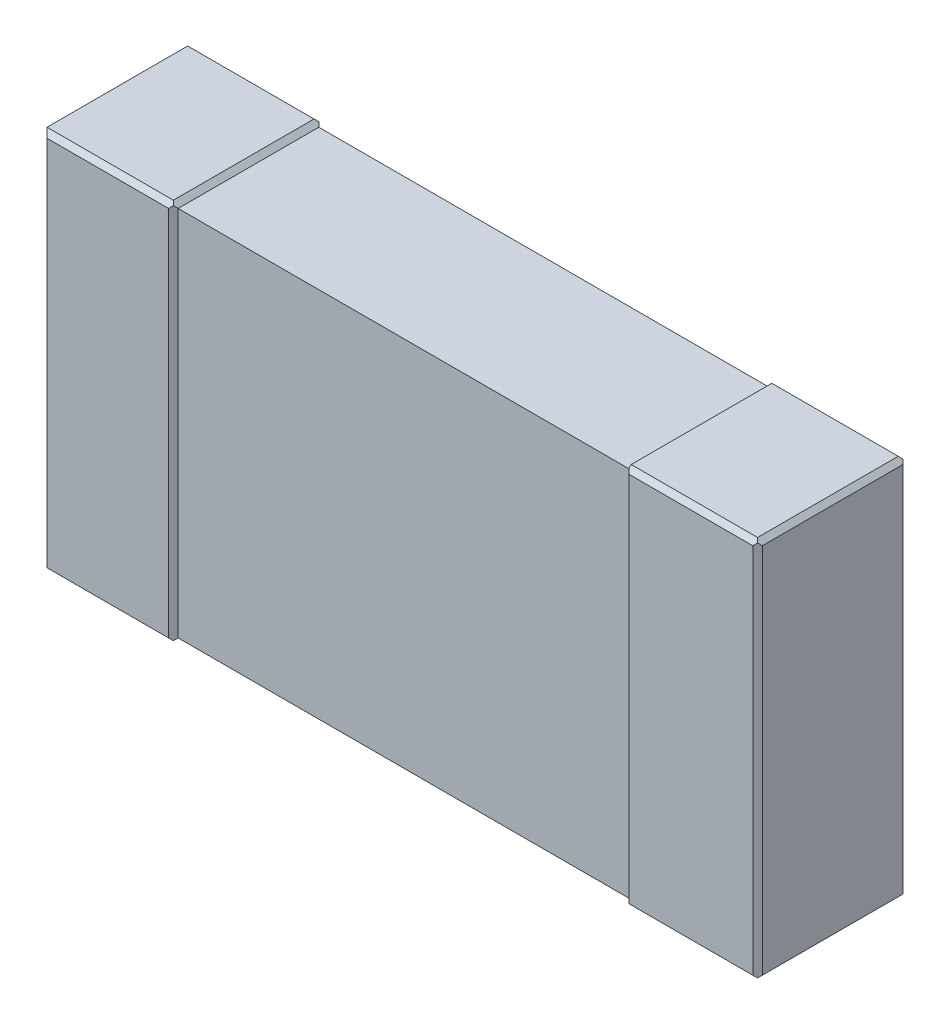
ISO-10303-21;
HEADER;
FILE_DESCRIPTION(('STEP AP214'),'2;1');
FILE_NAME('part.step','',(''),(''),'','','');
FILE_SCHEMA(('AUTOMOTIVE_DESIGN { 1 0 10303 214 1 1 1 1 }'));
ENDSEC;
DATA;
#1=APPLICATION_CONTEXT('core data for automotive mechanical design processes');
#2=APPLICATION_PROTOCOL_DEFINITION('international standard','automotive_design',2000,#1);
#3=PRODUCT_CONTEXT('',#1,'mechanical');
#4=PRODUCT('Part','Part','',(#3));
#5=PRODUCT_RELATED_PRODUCT_CATEGORY('part','',(#4));
#6=PRODUCT_DEFINITION_FORMATION('','',#4);
#7=PRODUCT_DEFINITION_CONTEXT('part definition',#1,'design');
#8=PRODUCT_DEFINITION('design','',#6,#7);
#9=PRODUCT_DEFINITION_SHAPE('','',#8);
#10=(LENGTH_UNIT() NAMED_UNIT(*) SI_UNIT(.MILLI.,.METRE.));
#11=(NAMED_UNIT(*) PLANE_ANGLE_UNIT() SI_UNIT($,.RADIAN.));
#12=(NAMED_UNIT(*) SI_UNIT($,.STERADIAN.) SOLID_ANGLE_UNIT());
#13=UNCERTAINTY_MEASURE_WITH_UNIT(LENGTH_MEASURE(1.E-05),#10,'distance_accuracy_value','');
#14=(GEOMETRIC_REPRESENTATION_CONTEXT(3) GLOBAL_UNCERTAINTY_ASSIGNED_CONTEXT((#13)) GLOBAL_UNIT_ASSIGNED_CONTEXT((#10,
#11,#12)) REPRESENTATION_CONTEXT('',''));
#15=CARTESIAN_POINT('',(0.,0.,0.));
#16=DIRECTION('',(0.,0.,1.));
#17=DIRECTION('',(1.,0.,0.));
#18=AXIS2_PLACEMENT_3D('',#15,#16,#17);
#19=CARTESIAN_POINT('',(1.5,-0.8,0.));
#20=DIRECTION('',(1.,0.,0.));
#21=DIRECTION('',(0.,0.,-1.));
#22=AXIS2_PLACEMENT_3D('',#19,#20,#21);
#23=PLANE('',#22);
#24=DIRECTION('',(0.,0.,-1.));
#25=VECTOR('',#24,1.);
#26=CARTESIAN_POINT('',(1.5,0.78,0.));
#27=LINE('',#26,#25);
#28=CARTESIAN_POINT('',(1.5,0.78,0.0199999999999998));
#29=VERTEX_POINT('',#28);
#30=CARTESIAN_POINT('',(1.5,0.780000000000001,0.61));
#31=VERTEX_POINT('',#30);
#32=EDGE_CURVE('E19',#29,#31,#27,.F.);
#33=ORIENTED_EDGE('',*,*,#32,.T.);
#34=DIRECTION('',(0.,1.,0.));
#35=VECTOR('',#34,1.);
#36=CARTESIAN_POINT('',(1.5,-0.8,0.61));
#37=LINE('',#36,#35);
#38=CARTESIAN_POINT('',(1.5,-0.78,0.61));
#39=VERTEX_POINT('',#38);
#40=EDGE_CURVE('E209',#39,#31,#37,.T.);
#41=ORIENTED_EDGE('',*,*,#40,.F.);
#42=DIRECTION('',(0.,0.,1.));
#43=VECTOR('',#42,1.);
#44=CARTESIAN_POINT('',(1.5,-0.78,0.));
#45=LINE('',#44,#43);
#46=CARTESIAN_POINT('',(1.5,-0.78,0.02));
#47=VERTEX_POINT('',#46);
#48=EDGE_CURVE('E248',#47,#39,#45,.T.);
#49=ORIENTED_EDGE('',*,*,#48,.F.);
#50=DIRECTION('',(0.,1.,0.));
#51=VECTOR('',#50,1.);
#52=CARTESIAN_POINT('',(1.5,0.8,0.0199999999999995));
#53=LINE('',#52,#51);
#54=EDGE_CURVE('E256',#29,#47,#53,.F.);
#55=ORIENTED_EDGE('',*,*,#54,.F.);
#56=EDGE_LOOP('',(#33,#41,#49,#55));
#57=FACE_BOUND('',#56,.T.);
#58=ADVANCED_FACE('F16',(#57),#23,.T.);
#59=CARTESIAN_POINT('',(-1.49,0.8,0.01));
#60=DIRECTION('',(-0.707106781186548,0.,-0.707106781186548));
#61=DIRECTION('',(-0.707106781186548,0.,0.707106781186548));
#62=AXIS2_PLACEMENT_3D('',#59,#60,#61);
#63=PLANE('',#62);
#64=DIRECTION('',(-0.577350269189622,-0.577350269189634,0.577350269189621));
#65=VECTOR('',#64,1.);
#66=CARTESIAN_POINT('',(-1.48,-0.780000000000001,0.));
#67=LINE('',#66,#65);
#68=CARTESIAN_POINT('',(-1.48,-0.780000000000001,0.));
#69=VERTEX_POINT('',#68);
#70=CARTESIAN_POINT('',(-1.49,-0.79,0.0100000000000002));
#71=VERTEX_POINT('',#70);
#72=EDGE_CURVE('E227',#69,#71,#67,.T.);
#73=ORIENTED_EDGE('',*,*,#72,.T.);
#74=DIRECTION('',(-0.57735026918963,0.577350269189618,0.57735026918963));
#75=VECTOR('',#74,1.);
#76=CARTESIAN_POINT('',(-1.49,-0.790000000000001,0.0100000000000004));
#77=LINE('',#76,#75);
#78=CARTESIAN_POINT('',(-1.5,-0.78,0.0200000000000001));
#79=VERTEX_POINT('',#78);
#80=EDGE_CURVE('E215',#71,#79,#77,.T.);
#81=ORIENTED_EDGE('',*,*,#80,.T.);
#82=DIRECTION('',(0.,1.,0.));
#83=VECTOR('',#82,1.);
#84=CARTESIAN_POINT('',(-1.5,0.8,0.02));
#85=LINE('',#84,#83);
#86=CARTESIAN_POINT('',(-1.5,0.8,0.02));
#87=VERTEX_POINT('',#86);
#88=EDGE_CURVE('E270',#87,#79,#85,.F.);
#89=ORIENTED_EDGE('',*,*,#88,.F.);
#90=DIRECTION('',(0.577350269189627,-0.577350269189624,-0.577350269189627));
#91=VECTOR('',#90,1.);
#92=CARTESIAN_POINT('',(-1.5,0.8,0.02));
#93=LINE('',#92,#91);
#94=CARTESIAN_POINT('',(-1.48,0.78,0.));
#95=VERTEX_POINT('',#94);
#96=EDGE_CURVE('E240',#87,#95,#93,.T.);
#97=ORIENTED_EDGE('',*,*,#96,.T.);
#98=DIRECTION('',(0.,1.,0.));
#99=VECTOR('',#98,1.);
#100=CARTESIAN_POINT('',(-1.48,0.8,0.));
#101=LINE('',#100,#99);
#102=EDGE_CURVE('E238',#69,#95,#101,.T.);
#103=ORIENTED_EDGE('',*,*,#102,.F.);
#104=EDGE_LOOP('',(#73,#81,#89,#97,#103));
#105=FACE_BOUND('',#104,.T.);
#106=ADVANCED_FACE('F236',(#105),#63,.T.);
#107=CARTESIAN_POINT('',(1.49,-0.8,0.62));
#108=DIRECTION('',(0.707106781186548,0.,0.707106781186548));
#109=DIRECTION('',(0.707106781186548,0.,-0.707106781186548));
#110=AXIS2_PLACEMENT_3D('',#107,#108,#109);
#111=PLANE('',#110);
#112=DIRECTION('',(0.577350269189628,-0.577350269189622,-0.577350269189628));
#113=VECTOR('',#112,1.);
#114=CARTESIAN_POINT('',(1.48,-0.78,0.63));
#115=LINE('',#114,#113);
#116=CARTESIAN_POINT('',(1.48,-0.78,0.63));
#117=VERTEX_POINT('',#116);
#118=CARTESIAN_POINT('',(1.49,-0.79,0.62));
#119=VERTEX_POINT('',#118);
#120=EDGE_CURVE('E246',#117,#119,#115,.T.);
#121=ORIENTED_EDGE('',*,*,#120,.T.);
#122=DIRECTION('',(-0.577350269189626,-0.577350269189626,0.577350269189626));
#123=VECTOR('',#122,1.);
#124=CARTESIAN_POINT('',(1.5,-0.78,0.61));
#125=LINE('',#124,#123);
#126=EDGE_CURVE('E251',#39,#119,#125,.T.);
#127=ORIENTED_EDGE('',*,*,#126,.F.);
#128=ORIENTED_EDGE('',*,*,#40,.T.);
#129=DIRECTION('',(0.577350269189626,-0.577350269189626,-0.577350269189626));
#130=VECTOR('',#129,1.);
#131=CARTESIAN_POINT('',(1.49,0.79,0.62));
#132=LINE('',#131,#130);
#133=CARTESIAN_POINT('',(1.49,0.79,0.62));
#134=VERTEX_POINT('',#133);
#135=EDGE_CURVE('E272',#134,#31,#132,.T.);
#136=ORIENTED_EDGE('',*,*,#135,.F.);
#137=DIRECTION('',(-0.57735026918963,-0.577350269189617,0.57735026918963));
#138=VECTOR('',#137,1.);
#139=CARTESIAN_POINT('',(1.49,0.790000000000001,0.62));
#140=LINE('',#139,#138);
#141=CARTESIAN_POINT('',(1.48,0.780000000000001,0.63));
#142=VERTEX_POINT('',#141);
#143=EDGE_CURVE('E244',#134,#142,#140,.T.);
#144=ORIENTED_EDGE('',*,*,#143,.T.);
#145=DIRECTION('',(0.,-1.,0.));
#146=VECTOR('',#145,1.);
#147=CARTESIAN_POINT('',(1.48,-0.8,0.63));
#148=LINE('',#147,#146);
#149=EDGE_CURVE('E278',#117,#142,#148,.F.);
#150=ORIENTED_EDGE('',*,*,#149,.F.);
#151=EDGE_LOOP('',(#121,#127,#128,#136,#144,#150));
#152=FACE_BOUND('',#151,.T.);
#153=ADVANCED_FACE('F635',(#152),#111,.T.);
#154=CARTESIAN_POINT('',(1.49,-0.79,0.));
#155=DIRECTION('',(0.707106781186548,-0.707106781186548,0.));
#156=DIRECTION('',(0.707106781186548,0.707106781186548,0.));
#157=AXIS2_PLACEMENT_3D('',#154,#155,#156);
#158=PLANE('',#157);
#159=DIRECTION('',(-0.577350269189627,-0.577350269189627,0.577350269189624));
#160=VECTOR('',#159,1.);
#161=CARTESIAN_POINT('',(1.49,-0.79,0.00999999999999997));
#162=LINE('',#161,#160);
#163=CARTESIAN_POINT('',(1.49,-0.790000000000001,0.00999999999999987));
#164=VERTEX_POINT('',#163);
#165=CARTESIAN_POINT('',(1.48,-0.8,0.02));
#166=VERTEX_POINT('',#165);
#167=EDGE_CURVE('E295',#164,#166,#162,.T.);
#168=ORIENTED_EDGE('',*,*,#167,.F.);
#169=DIRECTION('',(-0.57735026918963,-0.577350269189618,-0.57735026918963));
#170=VECTOR('',#169,1.);
#171=CARTESIAN_POINT('',(1.5,-0.780000000000001,0.0199999999999998));
#172=LINE('',#171,#170);
#173=EDGE_CURVE('E259',#47,#164,#172,.T.);
#174=ORIENTED_EDGE('',*,*,#173,.F.);
#175=ORIENTED_EDGE('',*,*,#48,.T.);
#176=ORIENTED_EDGE('',*,*,#126,.T.);
#177=DIRECTION('',(0.577350269189626,0.577350269189626,0.577350269189626));
#178=VECTOR('',#177,1.);
#179=CARTESIAN_POINT('',(1.48,-0.8,0.61));
#180=LINE('',#179,#178);
#181=CARTESIAN_POINT('',(1.48,-0.8,0.61));
#182=VERTEX_POINT('',#181);
#183=EDGE_CURVE('E283',#182,#119,#180,.T.);
#184=ORIENTED_EDGE('',*,*,#183,.F.);
#185=DIRECTION('',(0.,0.,-1.));
#186=VECTOR('',#185,1.);
#187=CARTESIAN_POINT('',(1.48,-0.8,0.));
#188=LINE('',#187,#186);
#189=EDGE_CURVE('E286',#166,#182,#188,.F.);
#190=ORIENTED_EDGE('',*,*,#189,.F.);
#191=EDGE_LOOP('',(#168,#174,#175,#176,#184,#190));
#192=FACE_BOUND('',#191,.T.);
#193=ADVANCED_FACE('F533',(#192),#158,.T.);
#194=CARTESIAN_POINT('',(1.49,0.8,0.009999999999999));
#195=DIRECTION('',(0.707106781186548,0.,-0.707106781186548));
#196=DIRECTION('',(-0.707106781186548,0.,-0.707106781186548));
#197=AXIS2_PLACEMENT_3D('',#194,#195,#196);
#198=PLANE('',#197);
#199=DIRECTION('',(0.577350269189626,-0.577350269189626,0.577350269189625));
#200=VECTOR('',#199,1.);
#201=CARTESIAN_POINT('',(1.48,-0.78,0.));
#202=LINE('',#201,#200);
#203=CARTESIAN_POINT('',(1.48,-0.780000000000001,0.));
#204=VERTEX_POINT('',#203);
#205=EDGE_CURVE('E292',#204,#164,#202,.T.);
#206=ORIENTED_EDGE('',*,*,#205,.F.);
#207=DIRECTION('',(0.,1.,0.));
#208=VECTOR('',#207,1.);
#209=CARTESIAN_POINT('',(1.48,0.8,0.));
#210=LINE('',#209,#208);
#211=CARTESIAN_POINT('',(1.48,0.78,0.));
#212=VERTEX_POINT('',#211);
#213=EDGE_CURVE('E301',#212,#204,#210,.F.);
#214=ORIENTED_EDGE('',*,*,#213,.F.);
#215=DIRECTION('',(0.577350269189624,0.57735026918963,0.577350269189623));
#216=VECTOR('',#215,1.);
#217=CARTESIAN_POINT('',(1.48,0.78,0.));
#218=LINE('',#217,#216);
#219=CARTESIAN_POINT('',(1.49,0.79,0.00999999999999907));
#220=VERTEX_POINT('',#219);
#221=EDGE_CURVE('E254',#212,#220,#218,.T.);
#222=ORIENTED_EDGE('',*,*,#221,.T.);
#223=DIRECTION('',(-0.577350269189605,0.577350269189611,-0.577350269189661));
#224=VECTOR('',#223,1.);
#225=CARTESIAN_POINT('',(1.5,0.78,0.0199999999999998));
#226=LINE('',#225,#224);
#227=EDGE_CURVE('E275',#29,#220,#226,.T.);
#228=ORIENTED_EDGE('',*,*,#227,.F.);
#229=ORIENTED_EDGE('',*,*,#54,.T.);
#230=ORIENTED_EDGE('',*,*,#173,.T.);
#231=EDGE_LOOP('',(#206,#214,#222,#228,#229,#230));
#232=FACE_BOUND('',#231,.T.);
#233=ADVANCED_FACE('F523',(#232),#198,.T.);
#234=CARTESIAN_POINT('',(-0.95,0.8,0.));
#235=DIRECTION('',(0.,0.,-1.));
#236=DIRECTION('',(0.,1.,0.));
#237=AXIS2_PLACEMENT_3D('',#234,#235,#236);
#238=PLANE('',#237);
#239=ORIENTED_EDGE('',*,*,#102,.T.);
#240=DIRECTION('',(1.,0.,0.));
#241=VECTOR('',#240,1.);
#242=CARTESIAN_POINT('',(-0.95,0.78,0.));
#243=LINE('',#242,#241);
#244=CARTESIAN_POINT('',(-0.97,0.78,0.));
#245=VERTEX_POINT('',#244);
#246=EDGE_CURVE('E264',#95,#245,#243,.T.);
#247=ORIENTED_EDGE('',*,*,#246,.T.);
#248=DIRECTION('',(0.,1.,0.));
#249=VECTOR('',#248,1.);
#250=CARTESIAN_POINT('',(-0.97,0.8,0.));
#251=LINE('',#250,#249);
#252=CARTESIAN_POINT('',(-0.97,-0.780000000000001,0.));
#253=VERTEX_POINT('',#252);
#254=EDGE_CURVE('E307',#253,#245,#251,.T.);
#255=ORIENTED_EDGE('',*,*,#254,.F.);
#256=DIRECTION('',(1.,0.,0.));
#257=VECTOR('',#256,1.);
#258=CARTESIAN_POINT('',(-0.95,-0.78,0.));
#259=LINE('',#258,#257);
#260=EDGE_CURVE('E261',#253,#69,#259,.F.);
#261=ORIENTED_EDGE('',*,*,#260,.T.);
#262=EDGE_LOOP('',(#239,#247,#255,#261));
#263=FACE_BOUND('',#262,.T.);
#264=ADVANCED_FACE('F520',(#263),#238,.T.);
#265=CARTESIAN_POINT('',(-1.5,0.8,0.));
#266=DIRECTION('',(-1.,0.,0.));
#267=DIRECTION('',(0.,0.,1.));
#268=AXIS2_PLACEMENT_3D('',#265,#266,#267);
#269=PLANE('',#268);
#270=DIRECTION('',(0.,0.,1.));
#271=VECTOR('',#270,1.);
#272=CARTESIAN_POINT('',(-1.5,0.8,0.));
#273=LINE('',#272,#271);
#274=CARTESIAN_POINT('',(-1.5,0.8,0.61));
#275=VERTEX_POINT('',#274);
#276=EDGE_CURVE('E267',#275,#87,#273,.F.);
#277=ORIENTED_EDGE('',*,*,#276,.T.);
#278=ORIENTED_EDGE('',*,*,#88,.T.);
#279=DIRECTION('',(0.,0.,1.));
#280=VECTOR('',#279,1.);
#281=CARTESIAN_POINT('',(-1.5,-0.78,0.));
#282=LINE('',#281,#280);
#283=CARTESIAN_POINT('',(-1.5,-0.78,0.61));
#284=VERTEX_POINT('',#283);
#285=EDGE_CURVE('E222',#79,#284,#282,.T.);
#286=ORIENTED_EDGE('',*,*,#285,.T.);
#287=DIRECTION('',(0.,1.,0.));
#288=VECTOR('',#287,1.);
#289=CARTESIAN_POINT('',(-1.5,0.8,0.61));
#290=LINE('',#289,#288);
#291=EDGE_CURVE('E317',#275,#284,#290,.F.);
#292=ORIENTED_EDGE('',*,*,#291,.F.);
#293=EDGE_LOOP('',(#277,#278,#286,#292));
#294=FACE_BOUND('',#293,.T.);
#295=ADVANCED_FACE('F522',(#294),#269,.T.);
#296=CARTESIAN_POINT('',(1.49,0.79,0.63));
#297=DIRECTION('',(0.707106781186548,0.707106781186548,0.));
#298=DIRECTION('',(-0.707106781186548,0.707106781186548,0.));
#299=AXIS2_PLACEMENT_3D('',#296,#297,#298);
#300=PLANE('',#299);
#301=DIRECTION('',(0.577350269189606,-0.577350269189638,-0.577350269189633));
#302=VECTOR('',#301,1.);
#303=CARTESIAN_POINT('',(1.48,0.8,0.0199999999999999));
#304=LINE('',#303,#302);
#305=CARTESIAN_POINT('',(1.48,0.8,0.0199999999999998));
#306=VERTEX_POINT('',#305);
#307=EDGE_CURVE('E334',#306,#220,#304,.T.);
#308=ORIENTED_EDGE('',*,*,#307,.F.);
#309=DIRECTION('',(0.,0.,1.));
#310=VECTOR('',#309,1.);
#311=CARTESIAN_POINT('',(1.48,0.8,0.63));
#312=LINE('',#311,#310);
#313=CARTESIAN_POINT('',(1.48,0.8,0.61));
#314=VERTEX_POINT('',#313);
#315=EDGE_CURVE('E339',#314,#306,#312,.F.);
#316=ORIENTED_EDGE('',*,*,#315,.F.);
#317=DIRECTION('',(-0.577350269189626,0.577350269189626,-0.577350269189626));
#318=VECTOR('',#317,1.);
#319=CARTESIAN_POINT('',(1.49,0.79,0.62));
#320=LINE('',#319,#318);
#321=EDGE_CURVE('E348',#134,#314,#320,.T.);
#322=ORIENTED_EDGE('',*,*,#321,.F.);
#323=ORIENTED_EDGE('',*,*,#135,.T.);
#324=ORIENTED_EDGE('',*,*,#32,.F.);
#325=ORIENTED_EDGE('',*,*,#227,.T.);
#326=EDGE_LOOP('',(#308,#316,#322,#323,#324,#325));
#327=FACE_BOUND('',#326,.T.);
#328=ADVANCED_FACE('F530',(#327),#300,.T.);
#329=CARTESIAN_POINT('',(0.95,-0.8,0.63));
#330=DIRECTION('',(0.,0.,1.));
#331=DIRECTION('',(0.,-1.,0.));
#332=AXIS2_PLACEMENT_3D('',#329,#330,#331);
#333=PLANE('',#332);
#334=DIRECTION('',(1.,0.,0.));
#335=VECTOR('',#334,1.);
#336=CARTESIAN_POINT('',(0.95,0.78,0.63));
#337=LINE('',#336,#335);
#338=CARTESIAN_POINT('',(0.96,0.780000000000001,0.63));
#339=VERTEX_POINT('',#338);
#340=EDGE_CURVE('E345',#339,#142,#337,.T.);
#341=ORIENTED_EDGE('',*,*,#340,.F.);
#342=DIRECTION('',(0.,1.,0.));
#343=VECTOR('',#342,1.);
#344=CARTESIAN_POINT('',(0.96,-0.78,0.63));
#345=LINE('',#344,#343);
#346=CARTESIAN_POINT('',(0.96,-0.78,0.63));
#347=VERTEX_POINT('',#346);
#348=EDGE_CURVE('E359',#339,#347,#345,.F.);
#349=ORIENTED_EDGE('',*,*,#348,.T.);
#350=DIRECTION('',(1.,0.,0.));
#351=VECTOR('',#350,1.);
#352=CARTESIAN_POINT('',(0.95,-0.78,0.63));
#353=LINE('',#352,#351);
#354=EDGE_CURVE('E281',#117,#347,#353,.F.);
#355=ORIENTED_EDGE('',*,*,#354,.F.);
#356=ORIENTED_EDGE('',*,*,#149,.T.);
#357=EDGE_LOOP('',(#341,#349,#355,#356));
#358=FACE_BOUND('',#357,.T.);
#359=ADVANCED_FACE('F616',(#358),#333,.T.);
#360=CARTESIAN_POINT('',(0.95,-0.79,0.62));
#361=DIRECTION('',(0.,-0.707106781186548,0.707106781186548));
#362=DIRECTION('',(0.,-0.707106781186548,-0.707106781186548));
#363=AXIS2_PLACEMENT_3D('',#360,#361,#362);
#364=PLANE('',#363);
#365=ORIENTED_EDGE('',*,*,#183,.T.);
#366=ORIENTED_EDGE('',*,*,#120,.F.);
#367=ORIENTED_EDGE('',*,*,#354,.T.);
#368=DIRECTION('',(-0.577350269189628,-0.577350269189622,-0.577350269189628));
#369=VECTOR('',#368,1.);
#370=CARTESIAN_POINT('',(0.96,-0.78,0.63));
#371=LINE('',#370,#369);
#372=CARTESIAN_POINT('',(0.95,-0.79,0.62));
#373=VERTEX_POINT('',#372);
#374=EDGE_CURVE('E354',#347,#373,#371,.T.);
#375=ORIENTED_EDGE('',*,*,#374,.T.);
#376=DIRECTION('',(0.577350269189626,-0.577350269189626,-0.577350269189626));
#377=VECTOR('',#376,1.);
#378=CARTESIAN_POINT('',(0.95,-0.79,0.62));
#379=LINE('',#378,#377);
#380=CARTESIAN_POINT('',(0.96,-0.8,0.61));
#381=VERTEX_POINT('',#380);
#382=EDGE_CURVE('E362',#373,#381,#379,.T.);
#383=ORIENTED_EDGE('',*,*,#382,.T.);
#384=DIRECTION('',(1.,0.,0.));
#385=VECTOR('',#384,1.);
#386=CARTESIAN_POINT('',(0.95,-0.8,0.61));
#387=LINE('',#386,#385);
#388=EDGE_CURVE('E289',#182,#381,#387,.F.);
#389=ORIENTED_EDGE('',*,*,#388,.F.);
#390=EDGE_LOOP('',(#365,#366,#367,#375,#383,#389));
#391=FACE_BOUND('',#390,.T.);
#392=ADVANCED_FACE('F612',(#391),#364,.T.);
#393=CARTESIAN_POINT('',(0.95,-0.8,0.));
#394=DIRECTION('',(0.,-1.,0.));
#395=DIRECTION('',(0.,0.,-1.));
#396=AXIS2_PLACEMENT_3D('',#393,#394,#395);
#397=PLANE('',#396);
#398=ORIENTED_EDGE('',*,*,#388,.T.);
#399=DIRECTION('',(0.,0.,1.));
#400=VECTOR('',#399,1.);
#401=CARTESIAN_POINT('',(0.96,-0.8,0.02));
#402=LINE('',#401,#400);
#403=CARTESIAN_POINT('',(0.96,-0.8,0.02));
#404=VERTEX_POINT('',#403);
#405=EDGE_CURVE('E364',#381,#404,#402,.F.);
#406=ORIENTED_EDGE('',*,*,#405,.T.);
#407=DIRECTION('',(1.,0.,0.));
#408=VECTOR('',#407,1.);
#409=CARTESIAN_POINT('',(0.95,-0.8,0.02));
#410=LINE('',#409,#408);
#411=EDGE_CURVE('E298',#166,#404,#410,.F.);
#412=ORIENTED_EDGE('',*,*,#411,.F.);
#413=ORIENTED_EDGE('',*,*,#189,.T.);
#414=EDGE_LOOP('',(#398,#406,#412,#413));
#415=FACE_BOUND('',#414,.T.);
#416=ADVANCED_FACE('F608',(#415),#397,.T.);
#417=CARTESIAN_POINT('',(0.95,-0.79,0.01));
#418=DIRECTION('',(0.,-0.707106781186548,-0.707106781186548));
#419=DIRECTION('',(0.,0.707106781186548,-0.707106781186548));
#420=AXIS2_PLACEMENT_3D('',#417,#418,#419);
#421=PLANE('',#420);
#422=DIRECTION('',(0.577350269189622,0.577350269189629,-0.577350269189626));
#423=VECTOR('',#422,1.);
#424=CARTESIAN_POINT('',(0.95,-0.790000000000001,0.0100000000000003));
#425=LINE('',#424,#423);
#426=CARTESIAN_POINT('',(0.95,-0.79,0.01));
#427=VERTEX_POINT('',#426);
#428=CARTESIAN_POINT('',(0.96,-0.780000000000001,0.));
#429=VERTEX_POINT('',#428);
#430=EDGE_CURVE('E370',#427,#429,#425,.T.);
#431=ORIENTED_EDGE('',*,*,#430,.T.);
#432=DIRECTION('',(1.,0.,0.));
#433=VECTOR('',#432,1.);
#434=CARTESIAN_POINT('',(0.95,-0.78,0.));
#435=LINE('',#434,#433);
#436=EDGE_CURVE('E304',#204,#429,#435,.F.);
#437=ORIENTED_EDGE('',*,*,#436,.F.);
#438=ORIENTED_EDGE('',*,*,#205,.T.);
#439=ORIENTED_EDGE('',*,*,#167,.T.);
#440=ORIENTED_EDGE('',*,*,#411,.T.);
#441=DIRECTION('',(-0.577350269189626,0.577350269189626,-0.577350269189625));
#442=VECTOR('',#441,1.);
#443=CARTESIAN_POINT('',(0.96,-0.8,0.02));
#444=LINE('',#443,#442);
#445=EDGE_CURVE('E366',#404,#427,#444,.T.);
#446=ORIENTED_EDGE('',*,*,#445,.T.);
#447=EDGE_LOOP('',(#431,#437,#438,#439,#440,#446));
#448=FACE_BOUND('',#447,.T.);
#449=ADVANCED_FACE('F604',(#448),#421,.T.);
#450=CARTESIAN_POINT('',(0.95,0.8,0.));
#451=DIRECTION('',(0.,0.,-1.));
#452=DIRECTION('',(0.,1.,0.));
#453=AXIS2_PLACEMENT_3D('',#450,#451,#452);
#454=PLANE('',#453);
#455=ORIENTED_EDGE('',*,*,#436,.T.);
#456=DIRECTION('',(0.,1.,0.));
#457=VECTOR('',#456,1.);
#458=CARTESIAN_POINT('',(0.96,0.78,0.));
#459=LINE('',#458,#457);
#460=CARTESIAN_POINT('',(0.96,0.78,0.));
#461=VERTEX_POINT('',#460);
#462=EDGE_CURVE('E372',#429,#461,#459,.T.);
#463=ORIENTED_EDGE('',*,*,#462,.T.);
#464=DIRECTION('',(1.,0.,0.));
#465=VECTOR('',#464,1.);
#466=CARTESIAN_POINT('',(0.95,0.78,0.));
#467=LINE('',#466,#465);
#468=EDGE_CURVE('E337',#212,#461,#467,.F.);
#469=ORIENTED_EDGE('',*,*,#468,.F.);
#470=ORIENTED_EDGE('',*,*,#213,.T.);
#471=EDGE_LOOP('',(#455,#463,#469,#470));
#472=FACE_BOUND('',#471,.T.);
#473=ADVANCED_FACE('F601',(#472),#454,.T.);
#474=CARTESIAN_POINT('',(-0.96,0.8,0.01));
#475=DIRECTION('',(0.707106781186548,0.,-0.707106781186548));
#476=DIRECTION('',(-0.707106781186548,0.,-0.707106781186548));
#477=AXIS2_PLACEMENT_3D('',#474,#475,#476);
#478=PLANE('',#477);
#479=DIRECTION('',(-0.57735026918963,-0.577350269189618,-0.57735026918963));
#480=VECTOR('',#479,1.);
#481=CARTESIAN_POINT('',(-0.95,-0.780000000000001,0.0200000000000005));
#482=LINE('',#481,#480);
#483=CARTESIAN_POINT('',(-0.95,-0.780000000000001,0.0200000000000003));
#484=VERTEX_POINT('',#483);
#485=CARTESIAN_POINT('',(-0.96,-0.790000000000001,0.0100000000000002));
#486=VERTEX_POINT('',#485);
#487=EDGE_CURVE('E312',#484,#486,#482,.T.);
#488=ORIENTED_EDGE('',*,*,#487,.T.);
#489=DIRECTION('',(0.577350269189642,-0.577350269189617,0.577350269189618));
#490=VECTOR('',#489,1.);
#491=CARTESIAN_POINT('',(-0.97,-0.780000000000001,0.));
#492=LINE('',#491,#490);
#493=EDGE_CURVE('E326',#253,#486,#492,.T.);
#494=ORIENTED_EDGE('',*,*,#493,.F.);
#495=ORIENTED_EDGE('',*,*,#254,.T.);
#496=DIRECTION('',(0.577350269189625,0.577350269189625,0.577350269189627));
#497=VECTOR('',#496,1.);
#498=CARTESIAN_POINT('',(-0.97,0.78,0.));
#499=LINE('',#498,#497);
#500=CARTESIAN_POINT('',(-0.96,0.79,0.00999999999999996));
#501=VERTEX_POINT('',#500);
#502=EDGE_CURVE('E234',#245,#501,#499,.T.);
#503=ORIENTED_EDGE('',*,*,#502,.T.);
#504=DIRECTION('',(0.577350269189628,-0.577350269189622,0.577350269189628));
#505=VECTOR('',#504,1.);
#506=CARTESIAN_POINT('',(-0.96,0.79,0.01));
#507=LINE('',#506,#505);
#508=CARTESIAN_POINT('',(-0.95,0.78,0.02));
#509=VERTEX_POINT('',#508);
#510=EDGE_CURVE('E310',#501,#509,#507,.T.);
#511=ORIENTED_EDGE('',*,*,#510,.T.);
#512=DIRECTION('',(0.,1.,0.));
#513=VECTOR('',#512,1.);
#514=CARTESIAN_POINT('',(-0.95,0.78,0.02));
#515=LINE('',#514,#513);
#516=EDGE_CURVE('E375',#484,#509,#515,.T.);
#517=ORIENTED_EDGE('',*,*,#516,.F.);
#518=EDGE_LOOP('',(#488,#494,#495,#503,#511,#517));
#519=FACE_BOUND('',#518,.T.);
#520=ADVANCED_FACE('F491',(#519),#478,.T.);
#521=CARTESIAN_POINT('',(-1.49,0.8,0.62));
#522=DIRECTION('',(-0.707106781186548,0.,0.707106781186548));
#523=DIRECTION('',(0.707106781186548,0.,0.707106781186548));
#524=AXIS2_PLACEMENT_3D('',#521,#522,#523);
#525=PLANE('',#524);
#526=DIRECTION('',(0.57735026918963,0.577350269189617,0.57735026918963));
#527=VECTOR('',#526,1.);
#528=CARTESIAN_POINT('',(-1.49,-0.790000000000001,0.62));
#529=LINE('',#528,#527);
#530=CARTESIAN_POINT('',(-1.49,-0.79,0.62));
#531=VERTEX_POINT('',#530);
#532=CARTESIAN_POINT('',(-1.48,-0.780000000000001,0.63));
#533=VERTEX_POINT('',#532);
#534=EDGE_CURVE('E320',#531,#533,#529,.T.);
#535=ORIENTED_EDGE('',*,*,#534,.T.);
#536=DIRECTION('',(0.,-1.,0.));
#537=VECTOR('',#536,1.);
#538=CARTESIAN_POINT('',(-1.48,0.8,0.63));
#539=LINE('',#538,#537);
#540=CARTESIAN_POINT('',(-1.48,0.78,0.63));
#541=VERTEX_POINT('',#540);
#542=EDGE_CURVE('E378',#541,#533,#539,.T.);
#543=ORIENTED_EDGE('',*,*,#542,.F.);
#544=DIRECTION('',(-0.577350269189627,0.577350269189624,-0.577350269189627));
#545=VECTOR('',#544,1.);
#546=CARTESIAN_POINT('',(-1.48,0.78,0.63));
#547=LINE('',#546,#545);
#548=EDGE_CURVE('E314',#541,#275,#547,.T.);
#549=ORIENTED_EDGE('',*,*,#548,.T.);
#550=ORIENTED_EDGE('',*,*,#291,.T.);
#551=DIRECTION('',(-0.577350269189624,0.57735026918963,-0.577350269189624));
#552=VECTOR('',#551,1.);
#553=CARTESIAN_POINT('',(-1.49,-0.79,0.62));
#554=LINE('',#553,#552);
#555=EDGE_CURVE('E322',#531,#284,#554,.T.);
#556=ORIENTED_EDGE('',*,*,#555,.F.);
#557=EDGE_LOOP('',(#535,#543,#549,#550,#556));
#558=FACE_BOUND('',#557,.T.);
#559=ADVANCED_FACE('F595',(#558),#525,.T.);
#560=CARTESIAN_POINT('',(-1.49,-0.79,0.));
#561=DIRECTION('',(-0.707106781186548,-0.707106781186548,0.));
#562=DIRECTION('',(0.707106781186548,-0.707106781186548,0.));
#563=AXIS2_PLACEMENT_3D('',#560,#561,#562);
#564=PLANE('',#563);
#565=DIRECTION('',(0.577350269189626,-0.577350269189626,-0.577350269189626));
#566=VECTOR('',#565,1.);
#567=CARTESIAN_POINT('',(-1.49,-0.79,0.62));
#568=LINE('',#567,#566);
#569=CARTESIAN_POINT('',(-1.48,-0.8,0.61));
#570=VERTEX_POINT('',#569);
#571=EDGE_CURVE('E381',#531,#570,#568,.T.);
#572=ORIENTED_EDGE('',*,*,#571,.F.);
#573=ORIENTED_EDGE('',*,*,#555,.T.);
#574=ORIENTED_EDGE('',*,*,#285,.F.);
#575=ORIENTED_EDGE('',*,*,#80,.F.);
#576=DIRECTION('',(-0.577350269189626,0.577350269189626,-0.577350269189626));
#577=VECTOR('',#576,1.);
#578=CARTESIAN_POINT('',(-1.48,-0.8,0.02));
#579=LINE('',#578,#577);
#580=CARTESIAN_POINT('',(-1.48,-0.8,0.02));
#581=VERTEX_POINT('',#580);
#582=EDGE_CURVE('E219',#581,#71,#579,.T.);
#583=ORIENTED_EDGE('',*,*,#582,.F.);
#584=DIRECTION('',(0.,0.,-1.));
#585=VECTOR('',#584,1.);
#586=CARTESIAN_POINT('',(-1.48,-0.8,0.63));
#587=LINE('',#586,#585);
#588=EDGE_CURVE('E324',#570,#581,#587,.T.);
#589=ORIENTED_EDGE('',*,*,#588,.F.);
#590=EDGE_LOOP('',(#572,#573,#574,#575,#583,#589));
#591=FACE_BOUND('',#590,.T.);
#592=ADVANCED_FACE('F218',(#591),#564,.T.);
#593=CARTESIAN_POINT('',(-1.5,-0.8,0.63));
#594=DIRECTION('',(0.,-1.,0.));
#595=DIRECTION('',(0.,0.,-1.));
#596=AXIS2_PLACEMENT_3D('',#593,#594,#595);
#597=PLANE('',#596);
#598=ORIENTED_EDGE('',*,*,#588,.T.);
#599=DIRECTION('',(1.,0.,0.));
#600=VECTOR('',#599,1.);
#601=CARTESIAN_POINT('',(-0.97,-0.8,0.02));
#602=LINE('',#601,#600);
#603=CARTESIAN_POINT('',(-0.97,-0.8,0.02));
#604=VERTEX_POINT('',#603);
#605=EDGE_CURVE('E233',#604,#581,#602,.F.);
#606=ORIENTED_EDGE('',*,*,#605,.F.);
#607=DIRECTION('',(0.,0.,1.));
#608=VECTOR('',#607,1.);
#609=CARTESIAN_POINT('',(-0.97,-0.8,0.63));
#610=LINE('',#609,#608);
#611=CARTESIAN_POINT('',(-0.97,-0.8,0.61));
#612=VERTEX_POINT('',#611);
#613=EDGE_CURVE('E392',#612,#604,#610,.F.);
#614=ORIENTED_EDGE('',*,*,#613,.F.);
#615=DIRECTION('',(1.,0.,0.));
#616=VECTOR('',#615,1.);
#617=CARTESIAN_POINT('',(-1.5,-0.8,0.61));
#618=LINE('',#617,#616);
#619=EDGE_CURVE('E384',#570,#612,#618,.T.);
#620=ORIENTED_EDGE('',*,*,#619,.F.);
#621=EDGE_LOOP('',(#598,#606,#614,#620));
#622=FACE_BOUND('',#621,.T.);
#623=ADVANCED_FACE('F517',(#622),#597,.T.);
#624=CARTESIAN_POINT('',(-0.97,-0.79,0.01));
#625=DIRECTION('',(0.,-0.707106781186548,-0.707106781186548));
#626=DIRECTION('',(0.,0.707106781186548,-0.707106781186548));
#627=AXIS2_PLACEMENT_3D('',#624,#625,#626);
#628=PLANE('',#627);
#629=ORIENTED_EDGE('',*,*,#72,.F.);
#630=ORIENTED_EDGE('',*,*,#260,.F.);
#631=ORIENTED_EDGE('',*,*,#493,.T.);
#632=DIRECTION('',(0.577350269189626,0.577350269189626,-0.577350269189626));
#633=VECTOR('',#632,1.);
#634=CARTESIAN_POINT('',(-0.97,-0.8,0.0199999999999998));
#635=LINE('',#634,#633);
#636=EDGE_CURVE('E395',#604,#486,#635,.T.);
#637=ORIENTED_EDGE('',*,*,#636,.F.);
#638=ORIENTED_EDGE('',*,*,#605,.T.);
#639=ORIENTED_EDGE('',*,*,#582,.T.);
#640=EDGE_LOOP('',(#629,#630,#631,#637,#638,#639));
#641=FACE_BOUND('',#640,.T.);
#642=ADVANCED_FACE('F230',(#641),#628,.T.);
#643=CARTESIAN_POINT('',(-0.97,0.79,0.01));
#644=DIRECTION('',(0.,-0.707106781186548,0.707106781186548));
#645=DIRECTION('',(0.,-0.707106781186548,-0.707106781186548));
#646=AXIS2_PLACEMENT_3D('',#643,#644,#645);
#647=PLANE('',#646);
#648=ORIENTED_EDGE('',*,*,#246,.F.);
#649=ORIENTED_EDGE('',*,*,#96,.F.);
#650=DIRECTION('',(1.,0.,0.));
#651=VECTOR('',#650,1.);
#652=CARTESIAN_POINT('',(-1.5,0.8,0.0200000000000001));
#653=LINE('',#652,#651);
#654=CARTESIAN_POINT('',(-0.97,0.8,0.0199999999999999));
#655=VERTEX_POINT('',#654);
#656=EDGE_CURVE('E332',#87,#655,#653,.T.);
#657=ORIENTED_EDGE('',*,*,#656,.T.);
#658=DIRECTION('',(0.577350269189626,-0.577350269189626,-0.577350269189626));
#659=VECTOR('',#658,1.);
#660=CARTESIAN_POINT('',(-0.97,0.8,0.0199999999999998));
#661=LINE('',#660,#659);
#662=EDGE_CURVE('E398',#655,#501,#661,.T.);
#663=ORIENTED_EDGE('',*,*,#662,.T.);
#664=ORIENTED_EDGE('',*,*,#502,.F.);
#665=EDGE_LOOP('',(#648,#649,#657,#663,#664));
#666=FACE_BOUND('',#665,.T.);
#667=ADVANCED_FACE('F498',(#666),#647,.F.);
#668=CARTESIAN_POINT('',(-1.5,0.8,0.63));
#669=DIRECTION('',(0.,-1.,0.));
#670=DIRECTION('',(0.,0.,-1.));
#671=AXIS2_PLACEMENT_3D('',#668,#669,#670);
#672=PLANE('',#671);
#673=ORIENTED_EDGE('',*,*,#276,.F.);
#674=DIRECTION('',(1.,0.,0.));
#675=VECTOR('',#674,1.);
#676=CARTESIAN_POINT('',(-1.48,0.8,0.61));
#677=LINE('',#676,#675);
#678=CARTESIAN_POINT('',(-0.97,0.8,0.61));
#679=VERTEX_POINT('',#678);
#680=EDGE_CURVE('E409',#275,#679,#677,.T.);
#681=ORIENTED_EDGE('',*,*,#680,.T.);
#682=DIRECTION('',(0.,0.,1.));
#683=VECTOR('',#682,1.);
#684=CARTESIAN_POINT('',(-0.97,0.8,0.63));
#685=LINE('',#684,#683);
#686=EDGE_CURVE('E401',#679,#655,#685,.F.);
#687=ORIENTED_EDGE('',*,*,#686,.T.);
#688=ORIENTED_EDGE('',*,*,#656,.F.);
#689=EDGE_LOOP('',(#673,#681,#687,#688));
#690=FACE_BOUND('',#689,.T.);
#691=ADVANCED_FACE('F501',(#690),#672,.F.);
#692=CARTESIAN_POINT('',(0.95,0.79,0.01));
#693=DIRECTION('',(0.,0.707106781186548,-0.707106781186548));
#694=DIRECTION('',(0.,0.707106781186548,0.707106781186548));
#695=AXIS2_PLACEMENT_3D('',#692,#693,#694);
#696=PLANE('',#695);
#697=ORIENTED_EDGE('',*,*,#468,.T.);
#698=DIRECTION('',(-0.577350269189632,0.577350269189614,0.577350269189631));
#699=VECTOR('',#698,1.);
#700=CARTESIAN_POINT('',(0.96,0.78,0.));
#701=LINE('',#700,#699);
#702=CARTESIAN_POINT('',(0.95,0.79,0.01));
#703=VERTEX_POINT('',#702);
#704=EDGE_CURVE('E368',#461,#703,#701,.T.);
#705=ORIENTED_EDGE('',*,*,#704,.T.);
#706=DIRECTION('',(0.,0.707106781186548,0.707106781186547));
#707=VECTOR('',#706,1.);
#708=CARTESIAN_POINT('',(0.95,0.79,0.01));
#709=LINE('',#708,#707);
#710=CARTESIAN_POINT('',(0.95,0.8,0.02));
#711=VERTEX_POINT('',#710);
#712=EDGE_CURVE('E418',#703,#711,#709,.T.);
#713=ORIENTED_EDGE('',*,*,#712,.T.);
#714=DIRECTION('',(1.,0.,0.));
#715=VECTOR('',#714,1.);
#716=CARTESIAN_POINT('',(0.95,0.8,0.0200000000000001));
#717=LINE('',#716,#715);
#718=EDGE_CURVE('E342',#306,#711,#717,.F.);
#719=ORIENTED_EDGE('',*,*,#718,.F.);
#720=ORIENTED_EDGE('',*,*,#307,.T.);
#721=ORIENTED_EDGE('',*,*,#221,.F.);
#722=EDGE_LOOP('',(#697,#705,#713,#719,#720,#721));
#723=FACE_BOUND('',#722,.T.);
#724=ADVANCED_FACE('F580',(#723),#696,.T.);
#725=CARTESIAN_POINT('',(0.95,0.8,0.63));
#726=DIRECTION('',(0.,1.,0.));
#727=DIRECTION('',(0.,0.,1.));
#728=AXIS2_PLACEMENT_3D('',#725,#726,#727);
#729=PLANE('',#728);
#730=DIRECTION('',(0.,0.,-1.));
#731=VECTOR('',#730,1.);
#732=CARTESIAN_POINT('',(0.95,0.8,0.));
#733=LINE('',#732,#731);
#734=CARTESIAN_POINT('',(0.95,0.8,0.61));
#735=VERTEX_POINT('',#734);
#736=EDGE_CURVE('E420',#711,#735,#733,.F.);
#737=ORIENTED_EDGE('',*,*,#736,.T.);
#738=DIRECTION('',(1.,0.,0.));
#739=VECTOR('',#738,1.);
#740=CARTESIAN_POINT('',(0.95,0.8,0.61));
#741=LINE('',#740,#739);
#742=EDGE_CURVE('E351',#314,#735,#741,.F.);
#743=ORIENTED_EDGE('',*,*,#742,.F.);
#744=ORIENTED_EDGE('',*,*,#315,.T.);
#745=ORIENTED_EDGE('',*,*,#718,.T.);
#746=EDGE_LOOP('',(#737,#743,#744,#745));
#747=FACE_BOUND('',#746,.T.);
#748=ADVANCED_FACE('F576',(#747),#729,.T.);
#749=CARTESIAN_POINT('',(0.95,0.79,0.62));
#750=DIRECTION('',(0.,0.707106781186548,0.707106781186548));
#751=DIRECTION('',(0.,-0.707106781186548,0.707106781186548));
#752=AXIS2_PLACEMENT_3D('',#749,#750,#751);
#753=PLANE('',#752);
#754=DIRECTION('',(0.,-0.707106781186548,0.707106781186548));
#755=VECTOR('',#754,1.);
#756=CARTESIAN_POINT('',(0.95,0.8,0.61));
#757=LINE('',#756,#755);
#758=CARTESIAN_POINT('',(0.95,0.79,0.62));
#759=VERTEX_POINT('',#758);
#760=EDGE_CURVE('E422',#735,#759,#757,.T.);
#761=ORIENTED_EDGE('',*,*,#760,.T.);
#762=DIRECTION('',(0.577350269189626,-0.577350269189626,0.577350269189626));
#763=VECTOR('',#762,1.);
#764=CARTESIAN_POINT('',(0.95,0.790000000000001,0.62));
#765=LINE('',#764,#763);
#766=EDGE_CURVE('E356',#759,#339,#765,.T.);
#767=ORIENTED_EDGE('',*,*,#766,.T.);
#768=ORIENTED_EDGE('',*,*,#340,.T.);
#769=ORIENTED_EDGE('',*,*,#143,.F.);
#770=ORIENTED_EDGE('',*,*,#321,.T.);
#771=ORIENTED_EDGE('',*,*,#742,.T.);
#772=EDGE_LOOP('',(#761,#767,#768,#769,#770,#771));
#773=FACE_BOUND('',#772,.T.);
#774=ADVANCED_FACE('F572',(#773),#753,.T.);
#775=CARTESIAN_POINT('',(0.955,-0.78,0.625));
#776=DIRECTION('',(0.707106781186548,0.,-0.707106781186548));
#777=DIRECTION('',(-0.707106781186548,0.,-0.707106781186548));
#778=AXIS2_PLACEMENT_3D('',#775,#776,#777);
#779=PLANE('',#778);
#780=ORIENTED_EDGE('',*,*,#766,.F.);
#781=DIRECTION('',(0.,1.,0.));
#782=VECTOR('',#781,1.);
#783=CARTESIAN_POINT('',(0.95,-0.8,0.62));
#784=LINE('',#783,#782);
#785=EDGE_CURVE('E424',#759,#373,#784,.F.);
#786=ORIENTED_EDGE('',*,*,#785,.T.);
#787=ORIENTED_EDGE('',*,*,#374,.F.);
#788=ORIENTED_EDGE('',*,*,#348,.F.);
#789=EDGE_LOOP('',(#780,#786,#787,#788));
#790=FACE_BOUND('',#789,.T.);
#791=ADVANCED_FACE('F568',(#790),#779,.F.);
#792=CARTESIAN_POINT('',(0.955,-0.795,0.02));
#793=DIRECTION('',(0.707106781186548,0.707106781186548,0.));
#794=DIRECTION('',(-0.707106781186548,0.707106781186548,0.));
#795=AXIS2_PLACEMENT_3D('',#792,#793,#794);
#796=PLANE('',#795);
#797=ORIENTED_EDGE('',*,*,#405,.F.);
#798=ORIENTED_EDGE('',*,*,#382,.F.);
#799=DIRECTION('',(0.,0.,-1.));
#800=VECTOR('',#799,1.);
#801=CARTESIAN_POINT('',(0.95,-0.79,0.));
#802=LINE('',#801,#800);
#803=EDGE_CURVE('E427',#373,#427,#802,.T.);
#804=ORIENTED_EDGE('',*,*,#803,.T.);
#805=ORIENTED_EDGE('',*,*,#445,.F.);
#806=EDGE_LOOP('',(#797,#798,#804,#805));
#807=FACE_BOUND('',#806,.T.);
#808=ADVANCED_FACE('F564',(#807),#796,.F.);
#809=CARTESIAN_POINT('',(0.955,0.78,0.005));
#810=DIRECTION('',(0.707106781186548,0.,0.707106781186548));
#811=DIRECTION('',(0.707106781186548,0.,-0.707106781186548));
#812=AXIS2_PLACEMENT_3D('',#809,#810,#811);
#813=PLANE('',#812);
#814=ORIENTED_EDGE('',*,*,#430,.F.);
#815=DIRECTION('',(0.,1.,0.));
#816=VECTOR('',#815,1.);
#817=CARTESIAN_POINT('',(0.95,-0.8,0.01));
#818=LINE('',#817,#816);
#819=EDGE_CURVE('E430',#427,#703,#818,.T.);
#820=ORIENTED_EDGE('',*,*,#819,.T.);
#821=ORIENTED_EDGE('',*,*,#704,.F.);
#822=ORIENTED_EDGE('',*,*,#462,.F.);
#823=EDGE_LOOP('',(#814,#820,#821,#822));
#824=FACE_BOUND('',#823,.T.);
#825=ADVANCED_FACE('F561',(#824),#813,.F.);
#826=CARTESIAN_POINT('',(-0.95,0.78,0.02));
#827=DIRECTION('',(0.,0.,-1.));
#828=DIRECTION('',(0.,1.,0.));
#829=AXIS2_PLACEMENT_3D('',#826,#827,#828);
#830=PLANE('',#829);
#831=DIRECTION('',(1.,0.,0.));
#832=VECTOR('',#831,1.);
#833=CARTESIAN_POINT('',(-0.95,-0.78,0.02));
#834=LINE('',#833,#832);
#835=CARTESIAN_POINT('',(0.95,-0.78,0.0200000000000001));
#836=VERTEX_POINT('',#835);
#837=EDGE_CURVE('E412',#484,#836,#834,.T.);
#838=ORIENTED_EDGE('',*,*,#837,.F.);
#839=ORIENTED_EDGE('',*,*,#516,.T.);
#840=DIRECTION('',(1.,0.,0.));
#841=VECTOR('',#840,1.);
#842=CARTESIAN_POINT('',(-0.95,0.78,0.0200000000000001));
#843=LINE('',#842,#841);
#844=CARTESIAN_POINT('',(0.95,0.78,0.0199999999999999));
#845=VERTEX_POINT('',#844);
#846=EDGE_CURVE('E440',#845,#509,#843,.F.);
#847=ORIENTED_EDGE('',*,*,#846,.F.);
#848=DIRECTION('',(0.,1.,0.));
#849=VECTOR('',#848,1.);
#850=CARTESIAN_POINT('',(0.95,-0.8,0.02));
#851=LINE('',#850,#849);
#852=EDGE_CURVE('E433',#845,#836,#851,.F.);
#853=ORIENTED_EDGE('',*,*,#852,.T.);
#854=EDGE_LOOP('',(#838,#839,#847,#853));
#855=FACE_BOUND('',#854,.T.);
#856=ADVANCED_FACE('F489',(#855),#830,.T.);
#857=CARTESIAN_POINT('',(-1.5,0.8,0.63));
#858=DIRECTION('',(0.,0.,1.));
#859=DIRECTION('',(0.,-1.,0.));
#860=AXIS2_PLACEMENT_3D('',#857,#858,#859);
#861=PLANE('',#860);
#862=DIRECTION('',(0.,1.,0.));
#863=VECTOR('',#862,1.);
#864=CARTESIAN_POINT('',(-0.97,0.8,0.63));
#865=LINE('',#864,#863);
#866=CARTESIAN_POINT('',(-0.97,0.78,0.63));
#867=VERTEX_POINT('',#866);
#868=CARTESIAN_POINT('',(-0.97,-0.780000000000001,0.630000000000001));
#869=VERTEX_POINT('',#868);
#870=EDGE_CURVE('E445',#867,#869,#865,.F.);
#871=ORIENTED_EDGE('',*,*,#870,.F.);
#872=DIRECTION('',(1.,0.,0.));
#873=VECTOR('',#872,1.);
#874=CARTESIAN_POINT('',(-1.48,0.78,0.63));
#875=LINE('',#874,#873);
#876=EDGE_CURVE('E406',#867,#541,#875,.F.);
#877=ORIENTED_EDGE('',*,*,#876,.T.);
#878=ORIENTED_EDGE('',*,*,#542,.T.);
#879=DIRECTION('',(1.,0.,0.));
#880=VECTOR('',#879,1.);
#881=CARTESIAN_POINT('',(-1.5,-0.78,0.63));
#882=LINE('',#881,#880);
#883=EDGE_CURVE('E386',#869,#533,#882,.F.);
#884=ORIENTED_EDGE('',*,*,#883,.F.);
#885=EDGE_LOOP('',(#871,#877,#878,#884));
#886=FACE_BOUND('',#885,.T.);
#887=ADVANCED_FACE('F510',(#886),#861,.T.);
#888=CARTESIAN_POINT('',(-1.5,-0.79,0.62));
#889=DIRECTION('',(0.,-0.707106781186548,0.707106781186548));
#890=DIRECTION('',(0.,-0.707106781186548,-0.707106781186548));
#891=AXIS2_PLACEMENT_3D('',#888,#889,#890);
#892=PLANE('',#891);
#893=DIRECTION('',(0.57735026918963,-0.577350269189617,-0.57735026918963));
#894=VECTOR('',#893,1.);
#895=CARTESIAN_POINT('',(-0.97,-0.780000000000001,0.63));
#896=LINE('',#895,#894);
#897=CARTESIAN_POINT('',(-0.96,-0.79,0.62));
#898=VERTEX_POINT('',#897);
#899=EDGE_CURVE('E448',#869,#898,#896,.T.);
#900=ORIENTED_EDGE('',*,*,#899,.F.);
#901=ORIENTED_EDGE('',*,*,#883,.T.);
#902=ORIENTED_EDGE('',*,*,#534,.F.);
#903=ORIENTED_EDGE('',*,*,#571,.T.);
#904=ORIENTED_EDGE('',*,*,#619,.T.);
#905=DIRECTION('',(-0.577350269189626,-0.577350269189626,-0.577350269189626));
#906=VECTOR('',#905,1.);
#907=CARTESIAN_POINT('',(-0.96,-0.79,0.62));
#908=LINE('',#907,#906);
#909=EDGE_CURVE('E389',#898,#612,#908,.T.);
#910=ORIENTED_EDGE('',*,*,#909,.F.);
#911=EDGE_LOOP('',(#900,#901,#902,#903,#904,#910));
#912=FACE_BOUND('',#911,.T.);
#913=ADVANCED_FACE('F513',(#912),#892,.T.);
#914=CARTESIAN_POINT('',(-0.96,-0.79,0.63));
#915=DIRECTION('',(0.707106781186548,-0.707106781186548,0.));
#916=DIRECTION('',(0.707106781186548,0.707106781186548,0.));
#917=AXIS2_PLACEMENT_3D('',#914,#915,#916);
#918=PLANE('',#917);
#919=DIRECTION('',(0.,0.,-1.));
#920=VECTOR('',#919,1.);
#921=CARTESIAN_POINT('',(-0.95,-0.78,0.02));
#922=LINE('',#921,#920);
#923=CARTESIAN_POINT('',(-0.95,-0.78,0.61));
#924=VERTEX_POINT('',#923);
#925=EDGE_CURVE('E415',#924,#484,#922,.T.);
#926=ORIENTED_EDGE('',*,*,#925,.F.);
#927=DIRECTION('',(0.57735026918963,0.577350269189617,-0.57735026918963));
#928=VECTOR('',#927,1.);
#929=CARTESIAN_POINT('',(-0.96,-0.790000000000001,0.62));
#930=LINE('',#929,#928);
#931=EDGE_CURVE('E451',#898,#924,#930,.T.);
#932=ORIENTED_EDGE('',*,*,#931,.F.);
#933=ORIENTED_EDGE('',*,*,#909,.T.);
#934=ORIENTED_EDGE('',*,*,#613,.T.);
#935=ORIENTED_EDGE('',*,*,#636,.T.);
#936=ORIENTED_EDGE('',*,*,#487,.F.);
#937=EDGE_LOOP('',(#926,#932,#933,#934,#935,#936));
#938=FACE_BOUND('',#937,.T.);
#939=ADVANCED_FACE('F478',(#938),#918,.T.);
#940=CARTESIAN_POINT('',(-0.96,0.79,0.63));
#941=DIRECTION('',(-0.707106781186548,-0.707106781186548,0.));
#942=DIRECTION('',(0.707106781186548,-0.707106781186548,0.));
#943=AXIS2_PLACEMENT_3D('',#940,#941,#942);
#944=PLANE('',#943);
#945=DIRECTION('',(0.577350269189622,-0.577350269189628,0.577350269189628));
#946=VECTOR('',#945,1.);
#947=CARTESIAN_POINT('',(-0.97,0.8,0.61));
#948=LINE('',#947,#946);
#949=CARTESIAN_POINT('',(-0.96,0.79,0.62));
#950=VERTEX_POINT('',#949);
#951=EDGE_CURVE('E404',#679,#950,#948,.T.);
#952=ORIENTED_EDGE('',*,*,#951,.T.);
#953=DIRECTION('',(-0.577350269189628,0.577350269189622,0.577350269189628));
#954=VECTOR('',#953,1.);
#955=CARTESIAN_POINT('',(-0.95,0.78,0.61));
#956=LINE('',#955,#954);
#957=CARTESIAN_POINT('',(-0.95,0.78,0.61));
#958=VERTEX_POINT('',#957);
#959=EDGE_CURVE('E34',#958,#950,#956,.T.);
#960=ORIENTED_EDGE('',*,*,#959,.F.);
#961=DIRECTION('',(0.,0.,1.));
#962=VECTOR('',#961,1.);
#963=CARTESIAN_POINT('',(-0.95,0.78,0.61));
#964=LINE('',#963,#962);
#965=EDGE_CURVE('E443',#509,#958,#964,.T.);
#966=ORIENTED_EDGE('',*,*,#965,.F.);
#967=ORIENTED_EDGE('',*,*,#510,.F.);
#968=ORIENTED_EDGE('',*,*,#662,.F.);
#969=ORIENTED_EDGE('',*,*,#686,.F.);
#970=EDGE_LOOP('',(#952,#960,#966,#967,#968,#969));
#971=FACE_BOUND('',#970,.T.);
#972=ADVANCED_FACE('F495',(#971),#944,.F.);
#973=CARTESIAN_POINT('',(-1.48,0.79,0.62));
#974=DIRECTION('',(0.,-0.707106781186548,-0.707106781186548));
#975=DIRECTION('',(0.,0.707106781186548,-0.707106781186548));
#976=AXIS2_PLACEMENT_3D('',#973,#974,#975);
#977=PLANE('',#976);
#978=ORIENTED_EDGE('',*,*,#548,.F.);
#979=ORIENTED_EDGE('',*,*,#876,.F.);
#980=DIRECTION('',(-0.577350269189628,-0.577350269189622,0.577350269189628));
#981=VECTOR('',#980,1.);
#982=CARTESIAN_POINT('',(-0.96,0.79,0.62));
#983=LINE('',#982,#981);
#984=EDGE_CURVE('E455',#950,#867,#983,.T.);
#985=ORIENTED_EDGE('',*,*,#984,.F.);
#986=ORIENTED_EDGE('',*,*,#951,.F.);
#987=ORIENTED_EDGE('',*,*,#680,.F.);
#988=EDGE_LOOP('',(#978,#979,#985,#986,#987));
#989=FACE_BOUND('',#988,.T.);
#990=ADVANCED_FACE('F507',(#989),#977,.F.);
#991=CARTESIAN_POINT('',(-0.95,-0.78,0.02));
#992=DIRECTION('',(0.,-1.,0.));
#993=DIRECTION('',(0.,0.,-1.));
#994=AXIS2_PLACEMENT_3D('',#991,#992,#993);
#995=PLANE('',#994);
#996=DIRECTION('',(1.,0.,0.));
#997=VECTOR('',#996,1.);
#998=CARTESIAN_POINT('',(-0.95,-0.78,0.61));
#999=LINE('',#998,#997);
#1000=CARTESIAN_POINT('',(0.95,-0.78,0.61));
#1001=VERTEX_POINT('',#1000);
#1002=EDGE_CURVE('E458',#924,#1001,#999,.T.);
#1003=ORIENTED_EDGE('',*,*,#1002,.F.);
#1004=ORIENTED_EDGE('',*,*,#925,.T.);
#1005=ORIENTED_EDGE('',*,*,#837,.T.);
#1006=DIRECTION('',(0.,0.,-1.));
#1007=VECTOR('',#1006,1.);
#1008=CARTESIAN_POINT('',(0.95,-0.78,0.));
#1009=LINE('',#1008,#1007);
#1010=EDGE_CURVE('E435',#836,#1001,#1009,.F.);
#1011=ORIENTED_EDGE('',*,*,#1010,.T.);
#1012=EDGE_LOOP('',(#1003,#1004,#1005,#1011));
#1013=FACE_BOUND('',#1012,.T.);
#1014=ADVANCED_FACE('F482',(#1013),#995,.T.);
#1015=CARTESIAN_POINT('',(0.95,-0.8,0.));
#1016=DIRECTION('',(1.,0.,0.));
#1017=DIRECTION('',(0.,0.,-1.));
#1018=AXIS2_PLACEMENT_3D('',#1015,#1016,#1017);
#1019=PLANE('',#1018);
#1020=DIRECTION('',(0.,-1.,0.));
#1021=VECTOR('',#1020,1.);
#1022=CARTESIAN_POINT('',(0.95,-0.78,0.61));
#1023=LINE('',#1022,#1021);
#1024=CARTESIAN_POINT('',(0.95,0.78,0.61));
#1025=VERTEX_POINT('',#1024);
#1026=EDGE_CURVE('E461',#1001,#1025,#1023,.F.);
#1027=ORIENTED_EDGE('',*,*,#1026,.F.);
#1028=ORIENTED_EDGE('',*,*,#1010,.F.);
#1029=ORIENTED_EDGE('',*,*,#852,.F.);
#1030=DIRECTION('',(0.,0.,1.));
#1031=VECTOR('',#1030,1.);
#1032=CARTESIAN_POINT('',(0.95,0.78,0.61));
#1033=LINE('',#1032,#1031);
#1034=EDGE_CURVE('E437',#1025,#845,#1033,.F.);
#1035=ORIENTED_EDGE('',*,*,#1034,.F.);
#1036=EDGE_LOOP('',(#1027,#1028,#1029,#1035));
#1037=FACE_BOUND('',#1036,.T.);
#1038=ORIENTED_EDGE('',*,*,#803,.F.);
#1039=ORIENTED_EDGE('',*,*,#785,.F.);
#1040=ORIENTED_EDGE('',*,*,#760,.F.);
#1041=ORIENTED_EDGE('',*,*,#736,.F.);
#1042=ORIENTED_EDGE('',*,*,#712,.F.);
#1043=ORIENTED_EDGE('',*,*,#819,.F.);
#1044=EDGE_LOOP('',(#1038,#1039,#1040,#1041,#1042,#1043));
#1045=FACE_BOUND('',#1044,.T.);
#1046=ADVANCED_FACE('F486',(#1037,#1045),#1019,.F.);
#1047=CARTESIAN_POINT('',(-0.95,0.78,0.61));
#1048=DIRECTION('',(0.,1.,0.));
#1049=DIRECTION('',(0.,0.,1.));
#1050=AXIS2_PLACEMENT_3D('',#1047,#1048,#1049);
#1051=PLANE('',#1050);
#1052=ORIENTED_EDGE('',*,*,#846,.T.);
#1053=ORIENTED_EDGE('',*,*,#965,.T.);
#1054=DIRECTION('',(1.,0.,0.));
#1055=VECTOR('',#1054,1.);
#1056=CARTESIAN_POINT('',(-0.95,0.78,0.609999999999999));
#1057=LINE('',#1056,#1055);
#1058=EDGE_CURVE('E25',#1025,#958,#1057,.F.);
#1059=ORIENTED_EDGE('',*,*,#1058,.F.);
#1060=ORIENTED_EDGE('',*,*,#1034,.T.);
#1061=EDGE_LOOP('',(#1052,#1053,#1059,#1060));
#1062=FACE_BOUND('',#1061,.T.);
#1063=ADVANCED_FACE('F471',(#1062),#1051,.T.);
#1064=CARTESIAN_POINT('',(-0.96,0.8,0.62));
#1065=DIRECTION('',(0.707106781186548,0.,0.707106781186548));
#1066=DIRECTION('',(0.707106781186548,0.,-0.707106781186548));
#1067=AXIS2_PLACEMENT_3D('',#1064,#1065,#1066);
#1068=PLANE('',#1067);
#1069=ORIENTED_EDGE('',*,*,#959,.T.);
#1070=ORIENTED_EDGE('',*,*,#984,.T.);
#1071=ORIENTED_EDGE('',*,*,#870,.T.);
#1072=ORIENTED_EDGE('',*,*,#899,.T.);
#1073=ORIENTED_EDGE('',*,*,#931,.T.);
#1074=DIRECTION('',(0.,-1.,0.));
#1075=VECTOR('',#1074,1.);
#1076=CARTESIAN_POINT('',(-0.95,-0.78,0.61));
#1077=LINE('',#1076,#1075);
#1078=EDGE_CURVE('E11',#958,#924,#1077,.T.);
#1079=ORIENTED_EDGE('',*,*,#1078,.F.);
#1080=EDGE_LOOP('',(#1069,#1070,#1071,#1072,#1073,#1079));
#1081=FACE_BOUND('',#1080,.T.);
#1082=ADVANCED_FACE('F474',(#1081),#1068,.T.);
#1083=CARTESIAN_POINT('',(-0.95,-0.78,0.61));
#1084=DIRECTION('',(0.,0.,1.));
#1085=DIRECTION('',(0.,-1.,0.));
#1086=AXIS2_PLACEMENT_3D('',#1083,#1084,#1085);
#1087=PLANE('',#1086);
#1088=ORIENTED_EDGE('',*,*,#1058,.T.);
#1089=ORIENTED_EDGE('',*,*,#1078,.T.);
#1090=ORIENTED_EDGE('',*,*,#1002,.T.);
#1091=ORIENTED_EDGE('',*,*,#1026,.T.);
#1092=EDGE_LOOP('',(#1088,#1089,#1090,#1091));
#1093=FACE_BOUND('',#1092,.T.);
#1094=ADVANCED_FACE('F467',(#1093),#1087,.T.);
#1095=CLOSED_SHELL('',(#58,#106,#153,#193,#233,#264,#295,#328,#359,#392,#416,#449,#473,#520,
#559,#592,#623,#642,#667,#691,#724,#748,#774,#791,#808,#825,#856,#887,#913,#939,#972,#990,#1014,
#1046,#1063,#1082,#1094));
#1096=MANIFOLD_SOLID_BREP('B1',#1095);
#1097=ADVANCED_BREP_SHAPE_REPRESENTATION('',(#18,#1096),#14);
#1098=SHAPE_DEFINITION_REPRESENTATION(#9,#1097);
ENDSEC;
END-ISO-10303-21;
